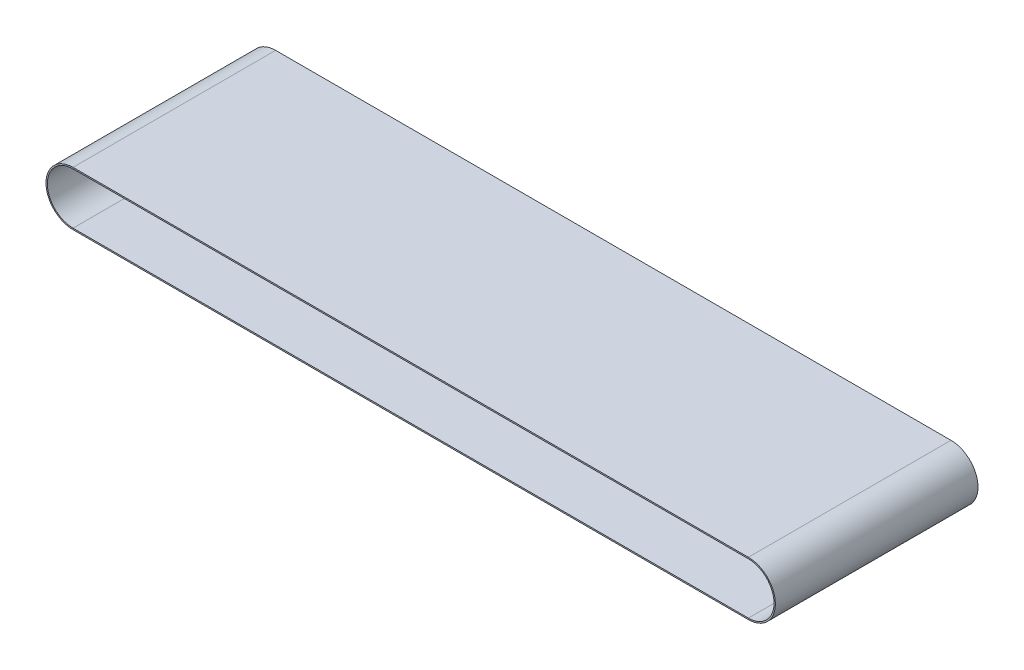
ISO-10303-21;
HEADER;
FILE_DESCRIPTION(('STEP AP214'),'2;1');
FILE_NAME('part.step','',(''),(''),'','','');
FILE_SCHEMA(('AUTOMOTIVE_DESIGN { 1 0 10303 214 1 1 1 1 }'));
ENDSEC;
DATA;
#1=APPLICATION_CONTEXT('core data for automotive mechanical design processes');
#2=APPLICATION_PROTOCOL_DEFINITION('international standard','automotive_design',2000,#1);
#3=PRODUCT_CONTEXT('',#1,'mechanical');
#4=PRODUCT('Part','Part','',(#3));
#5=PRODUCT_RELATED_PRODUCT_CATEGORY('part','',(#4));
#6=PRODUCT_DEFINITION_FORMATION('','',#4);
#7=PRODUCT_DEFINITION_CONTEXT('part definition',#1,'design');
#8=PRODUCT_DEFINITION('design','',#6,#7);
#9=PRODUCT_DEFINITION_SHAPE('','',#8);
#10=(LENGTH_UNIT() NAMED_UNIT(*) SI_UNIT(.MILLI.,.METRE.));
#11=(NAMED_UNIT(*) PLANE_ANGLE_UNIT() SI_UNIT($,.RADIAN.));
#12=(NAMED_UNIT(*) SI_UNIT($,.STERADIAN.) SOLID_ANGLE_UNIT());
#13=UNCERTAINTY_MEASURE_WITH_UNIT(LENGTH_MEASURE(1.E-05),#10,'distance_accuracy_value','');
#14=(GEOMETRIC_REPRESENTATION_CONTEXT(3) GLOBAL_UNCERTAINTY_ASSIGNED_CONTEXT((#13)) GLOBAL_UNIT_ASSIGNED_CONTEXT((#10,
#11,#12)) REPRESENTATION_CONTEXT('',''));
#15=CARTESIAN_POINT('',(0.,0.,0.));
#16=DIRECTION('',(0.,0.,1.));
#17=DIRECTION('',(1.,0.,0.));
#18=AXIS2_PLACEMENT_3D('',#15,#16,#17);
#19=CARTESIAN_POINT('',(-500.,0.,150.));
#20=DIRECTION('',(0.,0.,1.));
#21=DIRECTION('',(1.,0.,0.));
#22=AXIS2_PLACEMENT_3D('',#19,#20,#21);
#23=PLANE('',#22);
#24=CARTESIAN_POINT('',(-500.,0.,150.));
#25=DIRECTION('',(0.,0.,1.));
#26=DIRECTION('',(1.,0.,0.));
#27=AXIS2_PLACEMENT_3D('',#24,#25,#26);
#28=CIRCLE('',#27,40.);
#29=CARTESIAN_POINT('',(-500.,40.,150.));
#30=VERTEX_POINT('',#29);
#31=CARTESIAN_POINT('',(-500.,-40.,150.));
#32=VERTEX_POINT('',#31);
#33=EDGE_CURVE('E164',#30,#32,#28,.T.);
#34=ORIENTED_EDGE('',*,*,#33,.T.);
#35=DIRECTION('',(1.,0.,0.));
#36=VECTOR('',#35,1.);
#37=CARTESIAN_POINT('',(-500.,-40.,150.));
#38=LINE('',#37,#36);
#39=CARTESIAN_POINT('',(500.,-39.9999999999998,150.));
#40=VERTEX_POINT('',#39);
#41=EDGE_CURVE('E167',#32,#40,#38,.T.);
#42=ORIENTED_EDGE('',*,*,#41,.T.);
#43=CARTESIAN_POINT('',(500.,0.,150.));
#44=DIRECTION('',(0.,0.,1.));
#45=DIRECTION('',(1.,0.,0.));
#46=AXIS2_PLACEMENT_3D('',#43,#44,#45);
#47=CIRCLE('',#46,40.);
#48=CARTESIAN_POINT('',(500.,40.,150.));
#49=VERTEX_POINT('',#48);
#50=EDGE_CURVE('E170',#40,#49,#47,.T.);
#51=ORIENTED_EDGE('',*,*,#50,.T.);
#52=DIRECTION('',(-1.,0.,0.));
#53=VECTOR('',#52,1.);
#54=CARTESIAN_POINT('',(-500.,40.,150.));
#55=LINE('',#54,#53);
#56=EDGE_CURVE('E172',#49,#30,#55,.T.);
#57=ORIENTED_EDGE('',*,*,#56,.T.);
#58=EDGE_LOOP('',(#34,#42,#51,#57));
#59=FACE_BOUND('',#58,.T.);
#60=DIRECTION('',(1.,0.,0.));
#61=VECTOR('',#60,1.);
#62=CARTESIAN_POINT('',(-500.,-38.,150.));
#63=LINE('',#62,#61);
#64=CARTESIAN_POINT('',(-500.,-38.,150.));
#65=VERTEX_POINT('',#64);
#66=CARTESIAN_POINT('',(500.,-38.,150.));
#67=VERTEX_POINT('',#66);
#68=EDGE_CURVE('E136',#65,#67,#63,.T.);
#69=ORIENTED_EDGE('',*,*,#68,.F.);
#70=CARTESIAN_POINT('',(-500.,0.,150.));
#71=DIRECTION('',(0.,0.,1.));
#72=DIRECTION('',(1.,0.,0.));
#73=AXIS2_PLACEMENT_3D('',#70,#71,#72);
#74=CIRCLE('',#73,38.);
#75=CARTESIAN_POINT('',(-500.,38.,150.));
#76=VERTEX_POINT('',#75);
#77=EDGE_CURVE('E128',#76,#65,#74,.T.);
#78=ORIENTED_EDGE('',*,*,#77,.F.);
#79=DIRECTION('',(-1.,0.,0.));
#80=VECTOR('',#79,1.);
#81=CARTESIAN_POINT('',(-500.,38.,150.));
#82=LINE('',#81,#80);
#83=CARTESIAN_POINT('',(500.,38.0000000000002,150.));
#84=VERTEX_POINT('',#83);
#85=EDGE_CURVE('E150',#84,#76,#82,.T.);
#86=ORIENTED_EDGE('',*,*,#85,.F.);
#87=CARTESIAN_POINT('',(500.,0.,150.));
#88=DIRECTION('',(0.,0.,1.));
#89=DIRECTION('',(1.,0.,0.));
#90=AXIS2_PLACEMENT_3D('',#87,#88,#89);
#91=CIRCLE('',#90,38.);
#92=EDGE_CURVE('E148',#67,#84,#91,.T.);
#93=ORIENTED_EDGE('',*,*,#92,.F.);
#94=EDGE_LOOP('',(#69,#78,#86,#93));
#95=FACE_BOUND('',#94,.T.);
#96=ADVANCED_FACE('F63',(#59,#95),#23,.T.);
#97=CARTESIAN_POINT('',(-500.,0.,-150.));
#98=DIRECTION('',(0.,0.,1.));
#99=DIRECTION('',(1.,0.,0.));
#100=AXIS2_PLACEMENT_3D('',#97,#98,#99);
#101=PLANE('',#100);
#102=CARTESIAN_POINT('',(-500.,0.,-150.));
#103=DIRECTION('',(0.,0.,1.));
#104=DIRECTION('',(1.,0.,0.));
#105=AXIS2_PLACEMENT_3D('',#102,#103,#104);
#106=CIRCLE('',#105,40.);
#107=CARTESIAN_POINT('',(-500.,40.,-150.));
#108=VERTEX_POINT('',#107);
#109=CARTESIAN_POINT('',(-500.,-40.,-150.));
#110=VERTEX_POINT('',#109);
#111=EDGE_CURVE('E144',#108,#110,#106,.T.);
#112=ORIENTED_EDGE('',*,*,#111,.F.);
#113=DIRECTION('',(-1.,0.,0.));
#114=VECTOR('',#113,1.);
#115=CARTESIAN_POINT('',(-500.,40.,-150.));
#116=LINE('',#115,#114);
#117=CARTESIAN_POINT('',(500.,40.,-150.));
#118=VERTEX_POINT('',#117);
#119=EDGE_CURVE('E168',#118,#108,#116,.T.);
#120=ORIENTED_EDGE('',*,*,#119,.F.);
#121=CARTESIAN_POINT('',(500.,0.,-150.));
#122=DIRECTION('',(0.,0.,1.));
#123=DIRECTION('',(1.,0.,0.));
#124=AXIS2_PLACEMENT_3D('',#121,#122,#123);
#125=CIRCLE('',#124,40.);
#126=CARTESIAN_POINT('',(500.,-39.9999999999998,-150.));
#127=VERTEX_POINT('',#126);
#128=EDGE_CURVE('E179',#127,#118,#125,.T.);
#129=ORIENTED_EDGE('',*,*,#128,.F.);
#130=DIRECTION('',(1.,0.,0.));
#131=VECTOR('',#130,1.);
#132=CARTESIAN_POINT('',(-500.,-40.,-150.));
#133=LINE('',#132,#131);
#134=EDGE_CURVE('E177',#110,#127,#133,.T.);
#135=ORIENTED_EDGE('',*,*,#134,.F.);
#136=EDGE_LOOP('',(#112,#120,#129,#135));
#137=FACE_BOUND('',#136,.T.);
#138=CARTESIAN_POINT('',(-500.,0.,-150.));
#139=DIRECTION('',(0.,0.,1.));
#140=DIRECTION('',(1.,0.,0.));
#141=AXIS2_PLACEMENT_3D('',#138,#139,#140);
#142=CIRCLE('',#141,38.);
#143=CARTESIAN_POINT('',(-500.,38.,-150.));
#144=VERTEX_POINT('',#143);
#145=CARTESIAN_POINT('',(-500.,-38.,-150.));
#146=VERTEX_POINT('',#145);
#147=EDGE_CURVE('E86',#144,#146,#142,.T.);
#148=ORIENTED_EDGE('',*,*,#147,.T.);
#149=DIRECTION('',(1.,0.,0.));
#150=VECTOR('',#149,1.);
#151=CARTESIAN_POINT('',(-500.,-38.,-150.));
#152=LINE('',#151,#150);
#153=CARTESIAN_POINT('',(500.,-38.,-150.));
#154=VERTEX_POINT('',#153);
#155=EDGE_CURVE('E143',#146,#154,#152,.T.);
#156=ORIENTED_EDGE('',*,*,#155,.T.);
#157=CARTESIAN_POINT('',(500.,0.,-150.));
#158=DIRECTION('',(0.,0.,1.));
#159=DIRECTION('',(1.,0.,0.));
#160=AXIS2_PLACEMENT_3D('',#157,#158,#159);
#161=CIRCLE('',#160,38.);
#162=CARTESIAN_POINT('',(500.,38.0000000000002,-150.));
#163=VERTEX_POINT('',#162);
#164=EDGE_CURVE('E156',#154,#163,#161,.T.);
#165=ORIENTED_EDGE('',*,*,#164,.T.);
#166=DIRECTION('',(-1.,0.,0.));
#167=VECTOR('',#166,1.);
#168=CARTESIAN_POINT('',(-500.,38.,-150.));
#169=LINE('',#168,#167);
#170=EDGE_CURVE('E137',#163,#144,#169,.T.);
#171=ORIENTED_EDGE('',*,*,#170,.T.);
#172=EDGE_LOOP('',(#148,#156,#165,#171));
#173=FACE_BOUND('',#172,.T.);
#174=ADVANCED_FACE('F197',(#137,#173),#101,.F.);
#175=CARTESIAN_POINT('',(-500.,0.,150.));
#176=DIRECTION('',(0.,0.,-1.));
#177=DIRECTION('',(-1.,0.,0.));
#178=AXIS2_PLACEMENT_3D('',#175,#176,#177);
#179=CYLINDRICAL_SURFACE('',#178,40.);
#180=ORIENTED_EDGE('',*,*,#111,.T.);
#181=DIRECTION('',(0.,0.,-1.));
#182=VECTOR('',#181,1.);
#183=CARTESIAN_POINT('',(-500.,-40.,150.));
#184=LINE('',#183,#182);
#185=EDGE_CURVE('E12',#32,#110,#184,.T.);
#186=ORIENTED_EDGE('',*,*,#185,.F.);
#187=ORIENTED_EDGE('',*,*,#33,.F.);
#188=DIRECTION('',(0.,0.,-1.));
#189=VECTOR('',#188,1.);
#190=CARTESIAN_POINT('',(-500.,40.,150.));
#191=LINE('',#190,#189);
#192=EDGE_CURVE('E174',#30,#108,#191,.T.);
#193=ORIENTED_EDGE('',*,*,#192,.T.);
#194=EDGE_LOOP('',(#180,#186,#187,#193));
#195=FACE_BOUND('',#194,.T.);
#196=ADVANCED_FACE('F65',(#195),#179,.T.);
#197=CARTESIAN_POINT('',(-500.,-40.,150.));
#198=DIRECTION('',(0.,1.,0.));
#199=DIRECTION('',(-1.,0.,0.));
#200=AXIS2_PLACEMENT_3D('',#197,#198,#199);
#201=PLANE('',#200);
#202=ORIENTED_EDGE('',*,*,#134,.T.);
#203=DIRECTION('',(0.,0.,-1.));
#204=VECTOR('',#203,1.);
#205=CARTESIAN_POINT('',(500.,-39.9999999999998,150.));
#206=LINE('',#205,#204);
#207=EDGE_CURVE('E71',#40,#127,#206,.T.);
#208=ORIENTED_EDGE('',*,*,#207,.F.);
#209=ORIENTED_EDGE('',*,*,#41,.F.);
#210=ORIENTED_EDGE('',*,*,#185,.T.);
#211=EDGE_LOOP('',(#202,#208,#209,#210));
#212=FACE_BOUND('',#211,.T.);
#213=ADVANCED_FACE('F207',(#212),#201,.F.);
#214=CARTESIAN_POINT('',(500.,0.,150.));
#215=DIRECTION('',(0.,0.,-1.));
#216=DIRECTION('',(-1.,0.,0.));
#217=AXIS2_PLACEMENT_3D('',#214,#215,#216);
#218=CYLINDRICAL_SURFACE('',#217,40.);
#219=ORIENTED_EDGE('',*,*,#128,.T.);
#220=DIRECTION('',(0.,0.,-1.));
#221=VECTOR('',#220,1.);
#222=CARTESIAN_POINT('',(500.,40.,150.));
#223=LINE('',#222,#221);
#224=EDGE_CURVE('E184',#49,#118,#223,.T.);
#225=ORIENTED_EDGE('',*,*,#224,.F.);
#226=ORIENTED_EDGE('',*,*,#50,.F.);
#227=ORIENTED_EDGE('',*,*,#207,.T.);
#228=EDGE_LOOP('',(#219,#225,#226,#227));
#229=FACE_BOUND('',#228,.T.);
#230=ADVANCED_FACE('F191',(#229),#218,.T.);
#231=CARTESIAN_POINT('',(-500.,40.,150.));
#232=DIRECTION('',(0.,-1.,0.));
#233=DIRECTION('',(1.,0.,0.));
#234=AXIS2_PLACEMENT_3D('',#231,#232,#233);
#235=PLANE('',#234);
#236=ORIENTED_EDGE('',*,*,#119,.T.);
#237=ORIENTED_EDGE('',*,*,#192,.F.);
#238=ORIENTED_EDGE('',*,*,#56,.F.);
#239=ORIENTED_EDGE('',*,*,#224,.T.);
#240=EDGE_LOOP('',(#236,#237,#238,#239));
#241=FACE_BOUND('',#240,.T.);
#242=ADVANCED_FACE('F201',(#241),#235,.F.);
#243=CARTESIAN_POINT('',(-500.,0.,150.));
#244=DIRECTION('',(0.,0.,-1.));
#245=DIRECTION('',(-1.,0.,0.));
#246=AXIS2_PLACEMENT_3D('',#243,#244,#245);
#247=CYLINDRICAL_SURFACE('',#246,38.);
#248=ORIENTED_EDGE('',*,*,#147,.F.);
#249=DIRECTION('',(0.,0.,-1.));
#250=VECTOR('',#249,1.);
#251=CARTESIAN_POINT('',(-500.,38.,150.));
#252=LINE('',#251,#250);
#253=EDGE_CURVE('E132',#76,#144,#252,.T.);
#254=ORIENTED_EDGE('',*,*,#253,.F.);
#255=ORIENTED_EDGE('',*,*,#77,.T.);
#256=DIRECTION('',(0.,0.,-1.));
#257=VECTOR('',#256,1.);
#258=CARTESIAN_POINT('',(-500.,-38.,150.));
#259=LINE('',#258,#257);
#260=EDGE_CURVE('E131',#65,#146,#259,.T.);
#261=ORIENTED_EDGE('',*,*,#260,.T.);
#262=EDGE_LOOP('',(#248,#254,#255,#261));
#263=FACE_BOUND('',#262,.T.);
#264=ADVANCED_FACE('F130',(#263),#247,.F.);
#265=CARTESIAN_POINT('',(-500.,-38.,150.));
#266=DIRECTION('',(0.,1.,0.));
#267=DIRECTION('',(-1.,0.,0.));
#268=AXIS2_PLACEMENT_3D('',#265,#266,#267);
#269=PLANE('',#268);
#270=ORIENTED_EDGE('',*,*,#155,.F.);
#271=ORIENTED_EDGE('',*,*,#260,.F.);
#272=ORIENTED_EDGE('',*,*,#68,.T.);
#273=DIRECTION('',(0.,0.,-1.));
#274=VECTOR('',#273,1.);
#275=CARTESIAN_POINT('',(500.,-38.,150.));
#276=LINE('',#275,#274);
#277=EDGE_CURVE('E145',#67,#154,#276,.T.);
#278=ORIENTED_EDGE('',*,*,#277,.T.);
#279=EDGE_LOOP('',(#270,#271,#272,#278));
#280=FACE_BOUND('',#279,.T.);
#281=ADVANCED_FACE('F140',(#280),#269,.T.);
#282=CARTESIAN_POINT('',(500.,0.,150.));
#283=DIRECTION('',(0.,0.,-1.));
#284=DIRECTION('',(-1.,0.,0.));
#285=AXIS2_PLACEMENT_3D('',#282,#283,#284);
#286=CYLINDRICAL_SURFACE('',#285,38.);
#287=ORIENTED_EDGE('',*,*,#164,.F.);
#288=ORIENTED_EDGE('',*,*,#277,.F.);
#289=ORIENTED_EDGE('',*,*,#92,.T.);
#290=DIRECTION('',(0.,0.,-1.));
#291=VECTOR('',#290,1.);
#292=CARTESIAN_POINT('',(500.,38.0000000000002,150.));
#293=LINE('',#292,#291);
#294=EDGE_CURVE('E78',#84,#163,#293,.T.);
#295=ORIENTED_EDGE('',*,*,#294,.T.);
#296=EDGE_LOOP('',(#287,#288,#289,#295));
#297=FACE_BOUND('',#296,.T.);
#298=ADVANCED_FACE('F230',(#297),#286,.F.);
#299=CARTESIAN_POINT('',(-500.,38.,150.));
#300=DIRECTION('',(0.,-1.,0.));
#301=DIRECTION('',(1.,0.,0.));
#302=AXIS2_PLACEMENT_3D('',#299,#300,#301);
#303=PLANE('',#302);
#304=ORIENTED_EDGE('',*,*,#170,.F.);
#305=ORIENTED_EDGE('',*,*,#294,.F.);
#306=ORIENTED_EDGE('',*,*,#85,.T.);
#307=ORIENTED_EDGE('',*,*,#253,.T.);
#308=EDGE_LOOP('',(#304,#305,#306,#307));
#309=FACE_BOUND('',#308,.T.);
#310=ADVANCED_FACE('F234',(#309),#303,.T.);
#311=CLOSED_SHELL('',(#96,#174,#196,#213,#230,#242,#264,#281,#298,#310));
#312=MANIFOLD_SOLID_BREP('B2',#311);
#313=ADVANCED_BREP_SHAPE_REPRESENTATION('',(#18,#312),#14);
#314=SHAPE_DEFINITION_REPRESENTATION(#9,#313);
ENDSEC;
END-ISO-10303-21;
